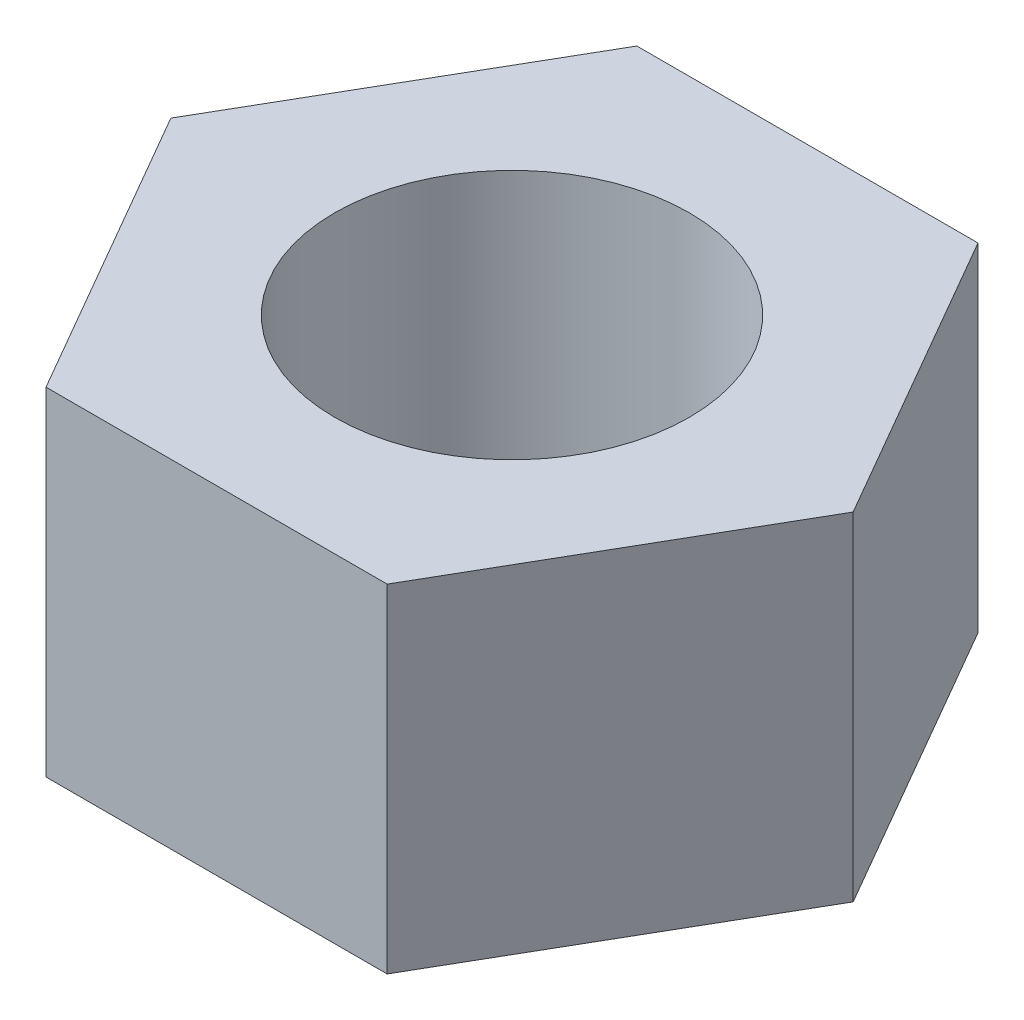
ISO-10303-21;
HEADER;
FILE_DESCRIPTION(('STEP AP214'),'2;1');
FILE_NAME('part.step','',(''),(''),'','','');
FILE_SCHEMA(('AUTOMOTIVE_DESIGN { 1 0 10303 214 1 1 1 1 }'));
ENDSEC;
DATA;
#1=APPLICATION_CONTEXT('core data for automotive mechanical design processes');
#2=APPLICATION_PROTOCOL_DEFINITION('international standard','automotive_design',2000,#1);
#3=PRODUCT_CONTEXT('',#1,'mechanical');
#4=PRODUCT('Part','Part','',(#3));
#5=PRODUCT_RELATED_PRODUCT_CATEGORY('part','',(#4));
#6=PRODUCT_DEFINITION_FORMATION('','',#4);
#7=PRODUCT_DEFINITION_CONTEXT('part definition',#1,'design');
#8=PRODUCT_DEFINITION('design','',#6,#7);
#9=PRODUCT_DEFINITION_SHAPE('','',#8);
#10=(LENGTH_UNIT() NAMED_UNIT(*) SI_UNIT(.MILLI.,.METRE.));
#11=(NAMED_UNIT(*) PLANE_ANGLE_UNIT() SI_UNIT($,.RADIAN.));
#12=(NAMED_UNIT(*) SI_UNIT($,.STERADIAN.) SOLID_ANGLE_UNIT());
#13=UNCERTAINTY_MEASURE_WITH_UNIT(LENGTH_MEASURE(1.E-05),#10,'distance_accuracy_value','');
#14=(GEOMETRIC_REPRESENTATION_CONTEXT(3) GLOBAL_UNCERTAINTY_ASSIGNED_CONTEXT((#13)) GLOBAL_UNIT_ASSIGNED_CONTEXT((#10,
#11,#12)) REPRESENTATION_CONTEXT('',''));
#15=CARTESIAN_POINT('',(0.,0.,0.));
#16=DIRECTION('',(0.,0.,1.));
#17=DIRECTION('',(1.,0.,0.));
#18=AXIS2_PLACEMENT_3D('',#15,#16,#17);
#19=CARTESIAN_POINT('',(0.,4.,0.));
#20=DIRECTION('',(0.,1.,0.));
#21=DIRECTION('',(0.,0.,1.));
#22=AXIS2_PLACEMENT_3D('',#19,#20,#21);
#23=PLANE('',#22);
#24=DIRECTION('',(0.499999999999995,0.,-0.866025403784441));
#25=VECTOR('',#24,1.);
#26=CARTESIAN_POINT('',(2.02072594216373,4.,3.49999999999998));
#27=LINE('',#26,#25);
#28=CARTESIAN_POINT('',(2.02072594216373,4.,3.49999999999998));
#29=VERTEX_POINT('',#28);
#30=CARTESIAN_POINT('',(4.04145188432738,4.,0.));
#31=VERTEX_POINT('',#30);
#32=EDGE_CURVE('E152',#29,#31,#27,.T.);
#33=ORIENTED_EDGE('',*,*,#32,.T.);
#34=DIRECTION('',(-0.500000000000001,0.,-0.866025403784438));
#35=VECTOR('',#34,1.);
#36=CARTESIAN_POINT('',(4.04145188432738,4.,0.));
#37=LINE('',#36,#35);
#38=CARTESIAN_POINT('',(2.02072594216368,4.,-3.50000000000001));
#39=VERTEX_POINT('',#38);
#40=EDGE_CURVE('E100',#31,#39,#37,.T.);
#41=ORIENTED_EDGE('',*,*,#40,.T.);
#42=DIRECTION('',(-1.,0.,0.));
#43=VECTOR('',#42,1.);
#44=CARTESIAN_POINT('',(2.02072594216368,4.,-3.50000000000001));
#45=LINE('',#44,#43);
#46=CARTESIAN_POINT('',(-2.02072594216371,4.,-3.49999999999999));
#47=VERTEX_POINT('',#46);
#48=EDGE_CURVE('E113',#39,#47,#45,.T.);
#49=ORIENTED_EDGE('',*,*,#48,.T.);
#50=DIRECTION('',(-0.499999999999995,0.,0.866025403784442));
#51=VECTOR('',#50,1.);
#52=CARTESIAN_POINT('',(-2.02072594216371,4.,-3.49999999999999));
#53=LINE('',#52,#51);
#54=CARTESIAN_POINT('',(-4.04145188432738,4.,0.));
#55=VERTEX_POINT('',#54);
#56=EDGE_CURVE('E107',#47,#55,#53,.T.);
#57=ORIENTED_EDGE('',*,*,#56,.T.);
#58=DIRECTION('',(0.500000000000007,0.,0.866025403784435));
#59=VECTOR('',#58,1.);
#60=CARTESIAN_POINT('',(-4.04145188432738,4.,0.));
#61=LINE('',#60,#59);
#62=CARTESIAN_POINT('',(-2.02072594216366,4.,3.50000000000002));
#63=VERTEX_POINT('',#62);
#64=EDGE_CURVE('E111',#55,#63,#61,.T.);
#65=ORIENTED_EDGE('',*,*,#64,.T.);
#66=DIRECTION('',(1.,0.,0.));
#67=VECTOR('',#66,1.);
#68=CARTESIAN_POINT('',(-2.02072594216366,4.,3.50000000000002));
#69=LINE('',#68,#67);
#70=EDGE_CURVE('E63',#63,#29,#69,.T.);
#71=ORIENTED_EDGE('',*,*,#70,.T.);
#72=EDGE_LOOP('',(#33,#41,#49,#57,#65,#71));
#73=FACE_BOUND('',#72,.T.);
#74=CARTESIAN_POINT('',(0.,4.,0.));
#75=DIRECTION('',(0.,1.,0.));
#76=DIRECTION('',(0.,0.,1.));
#77=AXIS2_PLACEMENT_3D('',#74,#75,#76);
#78=CIRCLE('',#77,2.1);
#79=CARTESIAN_POINT('',(0.,4.,2.1));
#80=VERTEX_POINT('',#79);
#81=EDGE_CURVE('E140',#80,#80,#78,.T.);
#82=ORIENTED_EDGE('',*,*,#81,.F.);
#83=EDGE_LOOP('',(#82));
#84=FACE_BOUND('',#83,.T.);
#85=ADVANCED_FACE('F45',(#73,#84),#23,.T.);
#86=CARTESIAN_POINT('',(0.,0.,0.));
#87=DIRECTION('',(0.,1.,0.));
#88=DIRECTION('',(0.,0.,1.));
#89=AXIS2_PLACEMENT_3D('',#86,#87,#88);
#90=PLANE('',#89);
#91=DIRECTION('',(0.499999999999995,0.,-0.866025403784441));
#92=VECTOR('',#91,1.);
#93=CARTESIAN_POINT('',(2.02072594216373,0.,3.49999999999998));
#94=LINE('',#93,#92);
#95=CARTESIAN_POINT('',(2.02072594216373,0.,3.49999999999998));
#96=VERTEX_POINT('',#95);
#97=CARTESIAN_POINT('',(4.04145188432738,0.,0.));
#98=VERTEX_POINT('',#97);
#99=EDGE_CURVE('E135',#96,#98,#94,.T.);
#100=ORIENTED_EDGE('',*,*,#99,.F.);
#101=DIRECTION('',(1.,0.,0.));
#102=VECTOR('',#101,1.);
#103=CARTESIAN_POINT('',(-2.02072594216366,0.,3.50000000000002));
#104=LINE('',#103,#102);
#105=CARTESIAN_POINT('',(-2.02072594216366,0.,3.50000000000002));
#106=VERTEX_POINT('',#105);
#107=EDGE_CURVE('E92',#106,#96,#104,.T.);
#108=ORIENTED_EDGE('',*,*,#107,.F.);
#109=DIRECTION('',(0.500000000000007,0.,0.866025403784435));
#110=VECTOR('',#109,1.);
#111=CARTESIAN_POINT('',(-4.04145188432738,0.,0.));
#112=LINE('',#111,#110);
#113=CARTESIAN_POINT('',(-4.04145188432738,0.,0.));
#114=VERTEX_POINT('',#113);
#115=EDGE_CURVE('E86',#114,#106,#112,.T.);
#116=ORIENTED_EDGE('',*,*,#115,.F.);
#117=DIRECTION('',(-0.499999999999995,0.,0.866025403784442));
#118=VECTOR('',#117,1.);
#119=CARTESIAN_POINT('',(-2.02072594216371,0.,-3.49999999999999));
#120=LINE('',#119,#118);
#121=CARTESIAN_POINT('',(-2.02072594216371,0.,-3.49999999999999));
#122=VERTEX_POINT('',#121);
#123=EDGE_CURVE('E122',#122,#114,#120,.T.);
#124=ORIENTED_EDGE('',*,*,#123,.F.);
#125=DIRECTION('',(-1.,0.,0.));
#126=VECTOR('',#125,1.);
#127=CARTESIAN_POINT('',(2.02072594216368,0.,-3.50000000000001));
#128=LINE('',#127,#126);
#129=CARTESIAN_POINT('',(2.02072594216368,0.,-3.50000000000001));
#130=VERTEX_POINT('',#129);
#131=EDGE_CURVE('E143',#130,#122,#128,.T.);
#132=ORIENTED_EDGE('',*,*,#131,.F.);
#133=DIRECTION('',(-0.500000000000001,0.,-0.866025403784438));
#134=VECTOR('',#133,1.);
#135=CARTESIAN_POINT('',(4.04145188432738,0.,0.));
#136=LINE('',#135,#134);
#137=EDGE_CURVE('E139',#98,#130,#136,.T.);
#138=ORIENTED_EDGE('',*,*,#137,.F.);
#139=EDGE_LOOP('',(#100,#108,#116,#124,#132,#138));
#140=FACE_BOUND('',#139,.T.);
#141=CARTESIAN_POINT('',(0.,0.,0.));
#142=DIRECTION('',(0.,1.,0.));
#143=DIRECTION('',(0.,0.,1.));
#144=AXIS2_PLACEMENT_3D('',#141,#142,#143);
#145=CIRCLE('',#144,2.1);
#146=CARTESIAN_POINT('',(0.,0.,2.1));
#147=VERTEX_POINT('',#146);
#148=EDGE_CURVE('E249',#147,#147,#145,.T.);
#149=ORIENTED_EDGE('',*,*,#148,.T.);
#150=EDGE_LOOP('',(#149));
#151=FACE_BOUND('',#150,.T.);
#152=ADVANCED_FACE('F165',(#140,#151),#90,.F.);
#153=CARTESIAN_POINT('',(2.02072594216373,4.,3.49999999999998));
#154=DIRECTION('',(-0.866025403784441,0.,-0.499999999999995));
#155=DIRECTION('',(-0.499999999999995,0.,0.866025403784442));
#156=AXIS2_PLACEMENT_3D('',#153,#154,#155);
#157=PLANE('',#156);
#158=ORIENTED_EDGE('',*,*,#99,.T.);
#159=DIRECTION('',(0.,-1.,0.));
#160=VECTOR('',#159,1.);
#161=CARTESIAN_POINT('',(4.04145188432738,4.,0.));
#162=LINE('',#161,#160);
#163=EDGE_CURVE('E11',#31,#98,#162,.T.);
#164=ORIENTED_EDGE('',*,*,#163,.F.);
#165=ORIENTED_EDGE('',*,*,#32,.F.);
#166=DIRECTION('',(0.,-1.,0.));
#167=VECTOR('',#166,1.);
#168=CARTESIAN_POINT('',(2.02072594216373,4.,3.49999999999998));
#169=LINE('',#168,#167);
#170=EDGE_CURVE('E131',#29,#96,#169,.T.);
#171=ORIENTED_EDGE('',*,*,#170,.T.);
#172=EDGE_LOOP('',(#158,#164,#165,#171));
#173=FACE_BOUND('',#172,.T.);
#174=ADVANCED_FACE('F47',(#173),#157,.F.);
#175=CARTESIAN_POINT('',(4.04145188432738,4.,0.));
#176=DIRECTION('',(-0.866025403784438,0.,0.500000000000001));
#177=DIRECTION('',(0.500000000000001,0.,0.866025403784438));
#178=AXIS2_PLACEMENT_3D('',#175,#176,#177);
#179=PLANE('',#178);
#180=ORIENTED_EDGE('',*,*,#137,.T.);
#181=DIRECTION('',(0.,-1.,0.));
#182=VECTOR('',#181,1.);
#183=CARTESIAN_POINT('',(2.02072594216368,4.,-3.50000000000001));
#184=LINE('',#183,#182);
#185=EDGE_CURVE('E55',#39,#130,#184,.T.);
#186=ORIENTED_EDGE('',*,*,#185,.F.);
#187=ORIENTED_EDGE('',*,*,#40,.F.);
#188=ORIENTED_EDGE('',*,*,#163,.T.);
#189=EDGE_LOOP('',(#180,#186,#187,#188));
#190=FACE_BOUND('',#189,.T.);
#191=ADVANCED_FACE('F190',(#190),#179,.F.);
#192=CARTESIAN_POINT('',(2.02072594216368,4.,-3.50000000000001));
#193=DIRECTION('',(0.,0.,1.));
#194=DIRECTION('',(1.,0.,0.));
#195=AXIS2_PLACEMENT_3D('',#192,#193,#194);
#196=PLANE('',#195);
#197=ORIENTED_EDGE('',*,*,#131,.T.);
#198=DIRECTION('',(0.,-1.,0.));
#199=VECTOR('',#198,1.);
#200=CARTESIAN_POINT('',(-2.02072594216371,4.,-3.49999999999999));
#201=LINE('',#200,#199);
#202=EDGE_CURVE('E124',#47,#122,#201,.T.);
#203=ORIENTED_EDGE('',*,*,#202,.F.);
#204=ORIENTED_EDGE('',*,*,#48,.F.);
#205=ORIENTED_EDGE('',*,*,#185,.T.);
#206=EDGE_LOOP('',(#197,#203,#204,#205));
#207=FACE_BOUND('',#206,.T.);
#208=ADVANCED_FACE('F162',(#207),#196,.F.);
#209=CARTESIAN_POINT('',(-2.02072594216371,4.,-3.49999999999999));
#210=DIRECTION('',(0.866025403784442,0.,0.499999999999995));
#211=DIRECTION('',(0.499999999999995,0.,-0.866025403784442));
#212=AXIS2_PLACEMENT_3D('',#209,#210,#211);
#213=PLANE('',#212);
#214=ORIENTED_EDGE('',*,*,#123,.T.);
#215=DIRECTION('',(0.,-1.,0.));
#216=VECTOR('',#215,1.);
#217=CARTESIAN_POINT('',(-4.04145188432738,4.,0.));
#218=LINE('',#217,#216);
#219=EDGE_CURVE('E119',#55,#114,#218,.T.);
#220=ORIENTED_EDGE('',*,*,#219,.F.);
#221=ORIENTED_EDGE('',*,*,#56,.F.);
#222=ORIENTED_EDGE('',*,*,#202,.T.);
#223=EDGE_LOOP('',(#214,#220,#221,#222));
#224=FACE_BOUND('',#223,.T.);
#225=ADVANCED_FACE('F120',(#224),#213,.F.);
#226=CARTESIAN_POINT('',(-4.04145188432738,4.,0.));
#227=DIRECTION('',(0.866025403784435,0.,-0.500000000000007));
#228=DIRECTION('',(-0.500000000000007,0.,-0.866025403784435));
#229=AXIS2_PLACEMENT_3D('',#226,#227,#228);
#230=PLANE('',#229);
#231=ORIENTED_EDGE('',*,*,#115,.T.);
#232=DIRECTION('',(0.,-1.,0.));
#233=VECTOR('',#232,1.);
#234=CARTESIAN_POINT('',(-2.02072594216366,4.,3.50000000000002));
#235=LINE('',#234,#233);
#236=EDGE_CURVE('E125',#63,#106,#235,.T.);
#237=ORIENTED_EDGE('',*,*,#236,.F.);
#238=ORIENTED_EDGE('',*,*,#64,.F.);
#239=ORIENTED_EDGE('',*,*,#219,.T.);
#240=EDGE_LOOP('',(#231,#237,#238,#239));
#241=FACE_BOUND('',#240,.T.);
#242=ADVANCED_FACE('F127',(#241),#230,.F.);
#243=CARTESIAN_POINT('',(-2.02072594216366,4.,3.50000000000002));
#244=DIRECTION('',(0.,0.,-1.));
#245=DIRECTION('',(-1.,0.,0.));
#246=AXIS2_PLACEMENT_3D('',#243,#244,#245);
#247=PLANE('',#246);
#248=ORIENTED_EDGE('',*,*,#107,.T.);
#249=ORIENTED_EDGE('',*,*,#170,.F.);
#250=ORIENTED_EDGE('',*,*,#70,.F.);
#251=ORIENTED_EDGE('',*,*,#236,.T.);
#252=EDGE_LOOP('',(#248,#249,#250,#251));
#253=FACE_BOUND('',#252,.T.);
#254=ADVANCED_FACE('F170',(#253),#247,.F.);
#255=CARTESIAN_POINT('',(0.,4.,0.));
#256=DIRECTION('',(0.,-1.,0.));
#257=DIRECTION('',(0.,0.,-1.));
#258=AXIS2_PLACEMENT_3D('',#255,#256,#257);
#259=CYLINDRICAL_SURFACE('',#258,2.1);
#260=ORIENTED_EDGE('',*,*,#81,.T.);
#261=EDGE_LOOP('',(#260));
#262=FACE_BOUND('',#261,.T.);
#263=ORIENTED_EDGE('',*,*,#148,.F.);
#264=EDGE_LOOP('',(#263));
#265=FACE_BOUND('',#264,.T.);
#266=ADVANCED_FACE('F172',(#262,#265),#259,.F.);
#267=CLOSED_SHELL('',(#85,#152,#174,#191,#208,#225,#242,#254,#266));
#268=MANIFOLD_SOLID_BREP('B2',#267);
#269=ADVANCED_BREP_SHAPE_REPRESENTATION('',(#18,#268),#14);
#270=SHAPE_DEFINITION_REPRESENTATION(#9,#269);
ENDSEC;
END-ISO-10303-21;
